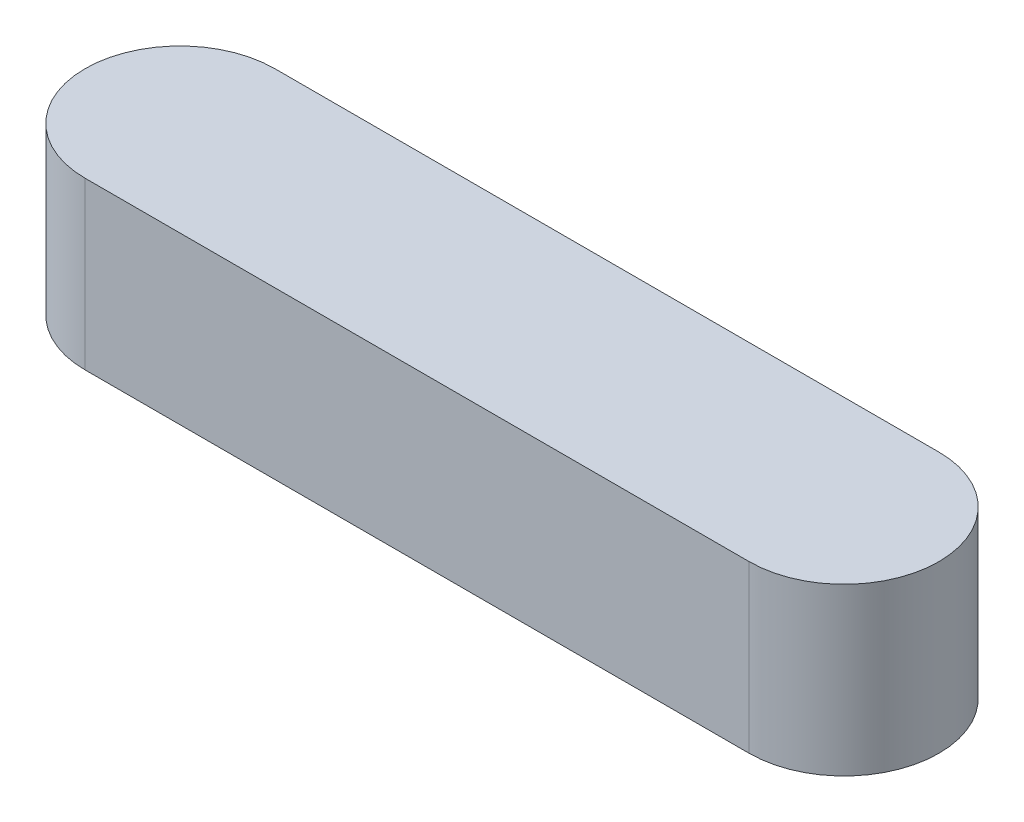
ISO-10303-21;
HEADER;
FILE_DESCRIPTION(('STEP AP214'),'2;1');
FILE_NAME('part.step','',(''),(''),'','','');
FILE_SCHEMA(('AUTOMOTIVE_DESIGN { 1 0 10303 214 1 1 1 1 }'));
ENDSEC;
DATA;
#1=APPLICATION_CONTEXT('core data for automotive mechanical design processes');
#2=APPLICATION_PROTOCOL_DEFINITION('international standard','automotive_design',2000,#1);
#3=PRODUCT_CONTEXT('',#1,'mechanical');
#4=PRODUCT('Part','Part','',(#3));
#5=PRODUCT_RELATED_PRODUCT_CATEGORY('part','',(#4));
#6=PRODUCT_DEFINITION_FORMATION('','',#4);
#7=PRODUCT_DEFINITION_CONTEXT('part definition',#1,'design');
#8=PRODUCT_DEFINITION('design','',#6,#7);
#9=PRODUCT_DEFINITION_SHAPE('','',#8);
#10=(LENGTH_UNIT() NAMED_UNIT(*) SI_UNIT(.MILLI.,.METRE.));
#11=(NAMED_UNIT(*) PLANE_ANGLE_UNIT() SI_UNIT($,.RADIAN.));
#12=(NAMED_UNIT(*) SI_UNIT($,.STERADIAN.) SOLID_ANGLE_UNIT());
#13=UNCERTAINTY_MEASURE_WITH_UNIT(LENGTH_MEASURE(1.E-05),#10,'distance_accuracy_value','');
#14=(GEOMETRIC_REPRESENTATION_CONTEXT(3) GLOBAL_UNCERTAINTY_ASSIGNED_CONTEXT((#13)) GLOBAL_UNIT_ASSIGNED_CONTEXT((#10,
#11,#12)) REPRESENTATION_CONTEXT('',''));
#15=CARTESIAN_POINT('',(0.,0.,0.));
#16=DIRECTION('',(0.,0.,1.));
#17=DIRECTION('',(1.,0.,0.));
#18=AXIS2_PLACEMENT_3D('',#15,#16,#17);
#19=CARTESIAN_POINT('',(0.,7.,0.));
#20=DIRECTION('',(0.,-1.,0.));
#21=DIRECTION('',(0.,0.,-1.));
#22=AXIS2_PLACEMENT_3D('',#19,#20,#21);
#23=CYLINDRICAL_SURFACE('',#22,4.);
#24=CARTESIAN_POINT('',(0.,0.,0.));
#25=DIRECTION('',(0.,1.,0.));
#26=DIRECTION('',(0.,0.,1.));
#27=AXIS2_PLACEMENT_3D('',#24,#25,#26);
#28=CIRCLE('',#27,4.);
#29=CARTESIAN_POINT('',(0.,0.,-4.));
#30=VERTEX_POINT('',#29);
#31=CARTESIAN_POINT('',(0.,0.,4.));
#32=VERTEX_POINT('',#31);
#33=EDGE_CURVE('E97',#30,#32,#28,.T.);
#34=ORIENTED_EDGE('',*,*,#33,.T.);
#35=DIRECTION('',(0.,-1.,0.));
#36=VECTOR('',#35,1.);
#37=CARTESIAN_POINT('',(0.,7.,4.));
#38=LINE('',#37,#36);
#39=CARTESIAN_POINT('',(0.,7.,4.));
#40=VERTEX_POINT('',#39);
#41=EDGE_CURVE('E11',#40,#32,#38,.T.);
#42=ORIENTED_EDGE('',*,*,#41,.F.);
#43=CARTESIAN_POINT('',(0.,7.,0.));
#44=DIRECTION('',(0.,1.,0.));
#45=DIRECTION('',(0.,0.,1.));
#46=AXIS2_PLACEMENT_3D('',#43,#44,#45);
#47=CIRCLE('',#46,4.);
#48=CARTESIAN_POINT('',(0.,7.,-4.));
#49=VERTEX_POINT('',#48);
#50=EDGE_CURVE('E85',#49,#40,#47,.T.);
#51=ORIENTED_EDGE('',*,*,#50,.F.);
#52=DIRECTION('',(0.,-1.,0.));
#53=VECTOR('',#52,1.);
#54=CARTESIAN_POINT('',(0.,7.,-4.));
#55=LINE('',#54,#53);
#56=EDGE_CURVE('E93',#49,#30,#55,.T.);
#57=ORIENTED_EDGE('',*,*,#56,.T.);
#58=EDGE_LOOP('',(#34,#42,#51,#57));
#59=FACE_BOUND('',#58,.T.);
#60=ADVANCED_FACE('F34',(#59),#23,.T.);
#61=CARTESIAN_POINT('',(0.,7.,4.));
#62=DIRECTION('',(0.,0.,-1.));
#63=DIRECTION('',(-1.,0.,0.));
#64=AXIS2_PLACEMENT_3D('',#61,#62,#63);
#65=PLANE('',#64);
#66=DIRECTION('',(1.,0.,0.));
#67=VECTOR('',#66,1.);
#68=CARTESIAN_POINT('',(0.,0.,4.));
#69=LINE('',#68,#67);
#70=CARTESIAN_POINT('',(28.,0.,4.));
#71=VERTEX_POINT('',#70);
#72=EDGE_CURVE('E89',#32,#71,#69,.T.);
#73=ORIENTED_EDGE('',*,*,#72,.T.);
#74=DIRECTION('',(0.,-1.,0.));
#75=VECTOR('',#74,1.);
#76=CARTESIAN_POINT('',(28.,7.,4.));
#77=LINE('',#76,#75);
#78=CARTESIAN_POINT('',(28.,7.,4.));
#79=VERTEX_POINT('',#78);
#80=EDGE_CURVE('E42',#79,#71,#77,.T.);
#81=ORIENTED_EDGE('',*,*,#80,.F.);
#82=DIRECTION('',(1.,0.,0.));
#83=VECTOR('',#82,1.);
#84=CARTESIAN_POINT('',(0.,7.,4.));
#85=LINE('',#84,#83);
#86=EDGE_CURVE('E80',#40,#79,#85,.T.);
#87=ORIENTED_EDGE('',*,*,#86,.F.);
#88=ORIENTED_EDGE('',*,*,#41,.T.);
#89=EDGE_LOOP('',(#73,#81,#87,#88));
#90=FACE_BOUND('',#89,.T.);
#91=ADVANCED_FACE('F88',(#90),#65,.F.);
#92=CARTESIAN_POINT('',(28.,7.,0.));
#93=DIRECTION('',(0.,-1.,0.));
#94=DIRECTION('',(0.,0.,-1.));
#95=AXIS2_PLACEMENT_3D('',#92,#93,#94);
#96=CYLINDRICAL_SURFACE('',#95,4.);
#97=CARTESIAN_POINT('',(28.,0.,0.));
#98=DIRECTION('',(0.,1.,0.));
#99=DIRECTION('',(0.,0.,1.));
#100=AXIS2_PLACEMENT_3D('',#97,#98,#99);
#101=CIRCLE('',#100,4.);
#102=CARTESIAN_POINT('',(28.,0.,-4.));
#103=VERTEX_POINT('',#102);
#104=EDGE_CURVE('E67',#71,#103,#101,.T.);
#105=ORIENTED_EDGE('',*,*,#104,.T.);
#106=DIRECTION('',(0.,-1.,0.));
#107=VECTOR('',#106,1.);
#108=CARTESIAN_POINT('',(28.,7.,-4.));
#109=LINE('',#108,#107);
#110=CARTESIAN_POINT('',(28.,7.,-4.));
#111=VERTEX_POINT('',#110);
#112=EDGE_CURVE('E90',#111,#103,#109,.T.);
#113=ORIENTED_EDGE('',*,*,#112,.F.);
#114=CARTESIAN_POINT('',(28.,7.,0.));
#115=DIRECTION('',(0.,1.,0.));
#116=DIRECTION('',(0.,0.,1.));
#117=AXIS2_PLACEMENT_3D('',#114,#115,#116);
#118=CIRCLE('',#117,4.);
#119=EDGE_CURVE('E83',#79,#111,#118,.T.);
#120=ORIENTED_EDGE('',*,*,#119,.F.);
#121=ORIENTED_EDGE('',*,*,#80,.T.);
#122=EDGE_LOOP('',(#105,#113,#120,#121));
#123=FACE_BOUND('',#122,.T.);
#124=ADVANCED_FACE('F91',(#123),#96,.T.);
#125=CARTESIAN_POINT('',(0.,7.,-4.));
#126=DIRECTION('',(0.,0.,1.));
#127=DIRECTION('',(1.,0.,0.));
#128=AXIS2_PLACEMENT_3D('',#125,#126,#127);
#129=PLANE('',#128);
#130=DIRECTION('',(-1.,0.,0.));
#131=VECTOR('',#130,1.);
#132=CARTESIAN_POINT('',(0.,0.,-4.));
#133=LINE('',#132,#131);
#134=EDGE_CURVE('E73',#103,#30,#133,.T.);
#135=ORIENTED_EDGE('',*,*,#134,.T.);
#136=ORIENTED_EDGE('',*,*,#56,.F.);
#137=DIRECTION('',(-1.,0.,0.));
#138=VECTOR('',#137,1.);
#139=CARTESIAN_POINT('',(0.,7.,-4.));
#140=LINE('',#139,#138);
#141=EDGE_CURVE('E50',#111,#49,#140,.T.);
#142=ORIENTED_EDGE('',*,*,#141,.F.);
#143=ORIENTED_EDGE('',*,*,#112,.T.);
#144=EDGE_LOOP('',(#135,#136,#142,#143));
#145=FACE_BOUND('',#144,.T.);
#146=ADVANCED_FACE('F104',(#145),#129,.F.);
#147=CARTESIAN_POINT('',(0.,7.,0.));
#148=DIRECTION('',(0.,1.,0.));
#149=DIRECTION('',(0.,0.,1.));
#150=AXIS2_PLACEMENT_3D('',#147,#148,#149);
#151=PLANE('',#150);
#152=ORIENTED_EDGE('',*,*,#50,.T.);
#153=ORIENTED_EDGE('',*,*,#86,.T.);
#154=ORIENTED_EDGE('',*,*,#119,.T.);
#155=ORIENTED_EDGE('',*,*,#141,.T.);
#156=EDGE_LOOP('',(#152,#153,#154,#155));
#157=FACE_BOUND('',#156,.T.);
#158=ADVANCED_FACE('F81',(#157),#151,.T.);
#159=CARTESIAN_POINT('',(0.,0.,0.));
#160=DIRECTION('',(0.,1.,0.));
#161=DIRECTION('',(0.,0.,1.));
#162=AXIS2_PLACEMENT_3D('',#159,#160,#161);
#163=PLANE('',#162);
#164=ORIENTED_EDGE('',*,*,#33,.F.);
#165=ORIENTED_EDGE('',*,*,#134,.F.);
#166=ORIENTED_EDGE('',*,*,#104,.F.);
#167=ORIENTED_EDGE('',*,*,#72,.F.);
#168=EDGE_LOOP('',(#164,#165,#166,#167));
#169=FACE_BOUND('',#168,.T.);
#170=ADVANCED_FACE('F107',(#169),#163,.F.);
#171=CLOSED_SHELL('',(#60,#91,#124,#146,#158,#170));
#172=MANIFOLD_SOLID_BREP('B2',#171);
#173=ADVANCED_BREP_SHAPE_REPRESENTATION('',(#18,#172),#14);
#174=SHAPE_DEFINITION_REPRESENTATION(#9,#173);
ENDSEC;
END-ISO-10303-21;
